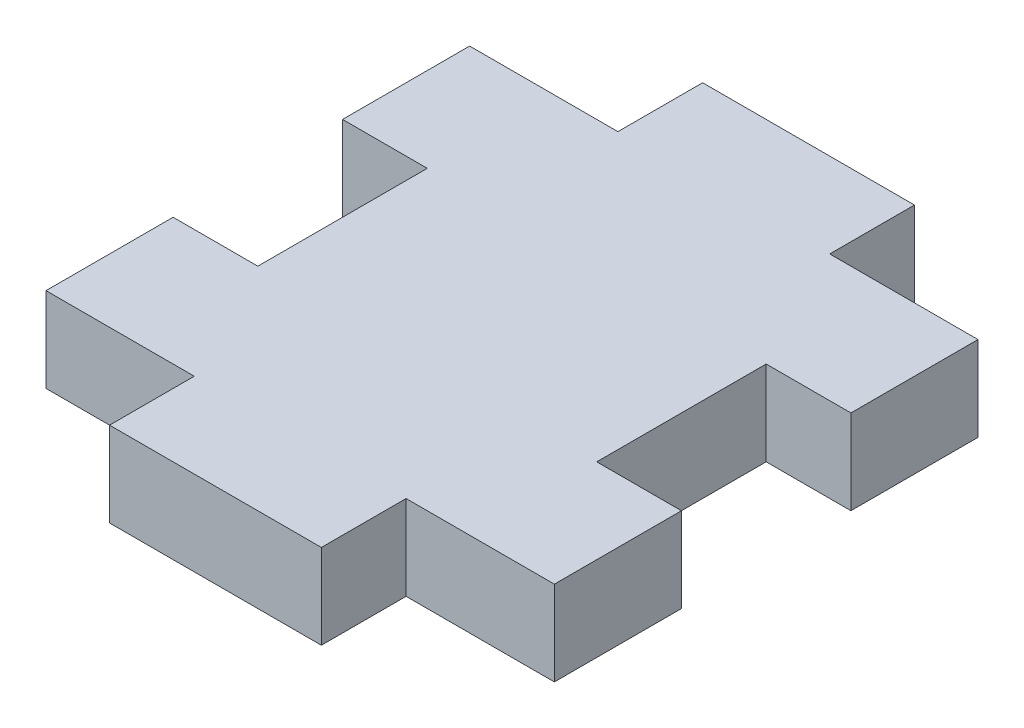
ISO-10303-21;
HEADER;
FILE_DESCRIPTION(('STEP AP214'),'2;1');
FILE_NAME('part.step','',(''),(''),'','','');
FILE_SCHEMA(('AUTOMOTIVE_DESIGN { 1 0 10303 214 1 1 1 1 }'));
ENDSEC;
DATA;
#1=APPLICATION_CONTEXT('core data for automotive mechanical design processes');
#2=APPLICATION_PROTOCOL_DEFINITION('international standard','automotive_design',2000,#1);
#3=PRODUCT_CONTEXT('',#1,'mechanical');
#4=PRODUCT('Part','Part','',(#3));
#5=PRODUCT_RELATED_PRODUCT_CATEGORY('part','',(#4));
#6=PRODUCT_DEFINITION_FORMATION('','',#4);
#7=PRODUCT_DEFINITION_CONTEXT('part definition',#1,'design');
#8=PRODUCT_DEFINITION('design','',#6,#7);
#9=PRODUCT_DEFINITION_SHAPE('','',#8);
#10=(LENGTH_UNIT() NAMED_UNIT(*) SI_UNIT(.MILLI.,.METRE.));
#11=(NAMED_UNIT(*) PLANE_ANGLE_UNIT() SI_UNIT($,.RADIAN.));
#12=(NAMED_UNIT(*) SI_UNIT($,.STERADIAN.) SOLID_ANGLE_UNIT());
#13=UNCERTAINTY_MEASURE_WITH_UNIT(LENGTH_MEASURE(1.E-05),#10,'distance_accuracy_value','');
#14=(GEOMETRIC_REPRESENTATION_CONTEXT(3) GLOBAL_UNCERTAINTY_ASSIGNED_CONTEXT((#13)) GLOBAL_UNIT_ASSIGNED_CONTEXT((#10,
#11,#12)) REPRESENTATION_CONTEXT('',''));
#15=CARTESIAN_POINT('',(0.,0.,0.));
#16=DIRECTION('',(0.,0.,1.));
#17=DIRECTION('',(1.,0.,0.));
#18=AXIS2_PLACEMENT_3D('',#15,#16,#17);
#19=CARTESIAN_POINT('',(38.1,12.7,31.75));
#20=DIRECTION('',(-1.,0.,0.));
#21=DIRECTION('',(0.,0.,1.));
#22=AXIS2_PLACEMENT_3D('',#19,#20,#21);
#23=PLANE('',#22);
#24=DIRECTION('',(0.,0.,-1.));
#25=VECTOR('',#24,1.);
#26=CARTESIAN_POINT('',(38.1,0.,31.75));
#27=LINE('',#26,#25);
#28=CARTESIAN_POINT('',(38.1,0.,31.75));
#29=VERTEX_POINT('',#28);
#30=CARTESIAN_POINT('',(38.1,0.,12.7));
#31=VERTEX_POINT('',#30);
#32=EDGE_CURVE('E204',#29,#31,#27,.T.);
#33=ORIENTED_EDGE('',*,*,#32,.T.);
#34=DIRECTION('',(0.,-1.,0.));
#35=VECTOR('',#34,1.);
#36=CARTESIAN_POINT('',(38.1,12.7,12.7));
#37=LINE('',#36,#35);
#38=CARTESIAN_POINT('',(38.1,12.7,12.7));
#39=VERTEX_POINT('',#38);
#40=EDGE_CURVE('E11',#39,#31,#37,.T.);
#41=ORIENTED_EDGE('',*,*,#40,.F.);
#42=DIRECTION('',(0.,0.,-1.));
#43=VECTOR('',#42,1.);
#44=CARTESIAN_POINT('',(38.1,12.7,31.75));
#45=LINE('',#44,#43);
#46=CARTESIAN_POINT('',(38.1,12.7,31.75));
#47=VERTEX_POINT('',#46);
#48=EDGE_CURVE('E254',#47,#39,#45,.T.);
#49=ORIENTED_EDGE('',*,*,#48,.F.);
#50=DIRECTION('',(0.,-1.,0.));
#51=VECTOR('',#50,1.);
#52=CARTESIAN_POINT('',(38.1,12.7,31.75));
#53=LINE('',#52,#51);
#54=EDGE_CURVE('E49',#47,#29,#53,.T.);
#55=ORIENTED_EDGE('',*,*,#54,.T.);
#56=EDGE_LOOP('',(#33,#41,#49,#55));
#57=FACE_BOUND('',#56,.T.);
#58=ADVANCED_FACE('F33',(#57),#23,.F.);
#59=CARTESIAN_POINT('',(38.1,12.7,12.7));
#60=DIRECTION('',(0.,0.,1.));
#61=DIRECTION('',(1.,0.,0.));
#62=AXIS2_PLACEMENT_3D('',#59,#60,#61);
#63=PLANE('',#62);
#64=DIRECTION('',(-1.,0.,0.));
#65=VECTOR('',#64,1.);
#66=CARTESIAN_POINT('',(38.1,0.,12.7));
#67=LINE('',#66,#65);
#68=CARTESIAN_POINT('',(25.4,0.,12.7));
#69=VERTEX_POINT('',#68);
#70=EDGE_CURVE('E206',#31,#69,#67,.T.);
#71=ORIENTED_EDGE('',*,*,#70,.T.);
#72=DIRECTION('',(0.,-1.,0.));
#73=VECTOR('',#72,1.);
#74=CARTESIAN_POINT('',(25.4,12.7,12.7));
#75=LINE('',#74,#73);
#76=CARTESIAN_POINT('',(25.4,12.7,12.7));
#77=VERTEX_POINT('',#76);
#78=EDGE_CURVE('E41',#77,#69,#75,.T.);
#79=ORIENTED_EDGE('',*,*,#78,.F.);
#80=DIRECTION('',(-1.,0.,0.));
#81=VECTOR('',#80,1.);
#82=CARTESIAN_POINT('',(38.1,12.7,12.7));
#83=LINE('',#82,#81);
#84=EDGE_CURVE('E124',#39,#77,#83,.T.);
#85=ORIENTED_EDGE('',*,*,#84,.F.);
#86=ORIENTED_EDGE('',*,*,#40,.T.);
#87=EDGE_LOOP('',(#71,#79,#85,#86));
#88=FACE_BOUND('',#87,.T.);
#89=ADVANCED_FACE('F363',(#88),#63,.F.);
#90=CARTESIAN_POINT('',(25.4,12.7,12.7));
#91=DIRECTION('',(-1.,0.,0.));
#92=DIRECTION('',(0.,0.,1.));
#93=AXIS2_PLACEMENT_3D('',#90,#91,#92);
#94=PLANE('',#93);
#95=DIRECTION('',(0.,0.,-1.));
#96=VECTOR('',#95,1.);
#97=CARTESIAN_POINT('',(25.4,0.,12.7));
#98=LINE('',#97,#96);
#99=CARTESIAN_POINT('',(25.4,0.,-12.7));
#100=VERTEX_POINT('',#99);
#101=EDGE_CURVE('E208',#69,#100,#98,.T.);
#102=ORIENTED_EDGE('',*,*,#101,.T.);
#103=DIRECTION('',(0.,-1.,0.));
#104=VECTOR('',#103,1.);
#105=CARTESIAN_POINT('',(25.4,12.7,-12.7));
#106=LINE('',#105,#104);
#107=CARTESIAN_POINT('',(25.4,12.7,-12.7));
#108=VERTEX_POINT('',#107);
#109=EDGE_CURVE('E288',#108,#100,#106,.T.);
#110=ORIENTED_EDGE('',*,*,#109,.F.);
#111=DIRECTION('',(0.,0.,-1.));
#112=VECTOR('',#111,1.);
#113=CARTESIAN_POINT('',(25.4,12.7,12.7));
#114=LINE('',#113,#112);
#115=EDGE_CURVE('E296',#77,#108,#114,.T.);
#116=ORIENTED_EDGE('',*,*,#115,.F.);
#117=ORIENTED_EDGE('',*,*,#78,.T.);
#118=EDGE_LOOP('',(#102,#110,#116,#117));
#119=FACE_BOUND('',#118,.T.);
#120=ADVANCED_FACE('F294',(#119),#94,.F.);
#121=CARTESIAN_POINT('',(25.4,12.7,-12.7));
#122=DIRECTION('',(0.,0.,-1.));
#123=DIRECTION('',(-1.,0.,0.));
#124=AXIS2_PLACEMENT_3D('',#121,#122,#123);
#125=PLANE('',#124);
#126=DIRECTION('',(1.,0.,0.));
#127=VECTOR('',#126,1.);
#128=CARTESIAN_POINT('',(25.4,0.,-12.7));
#129=LINE('',#128,#127);
#130=CARTESIAN_POINT('',(38.1,0.,-12.7));
#131=VERTEX_POINT('',#130);
#132=EDGE_CURVE('E210',#100,#131,#129,.T.);
#133=ORIENTED_EDGE('',*,*,#132,.T.);
#134=DIRECTION('',(0.,-1.,0.));
#135=VECTOR('',#134,1.);
#136=CARTESIAN_POINT('',(38.1,12.7,-12.7));
#137=LINE('',#136,#135);
#138=CARTESIAN_POINT('',(38.1,12.7,-12.7));
#139=VERTEX_POINT('',#138);
#140=EDGE_CURVE('E285',#139,#131,#137,.T.);
#141=ORIENTED_EDGE('',*,*,#140,.F.);
#142=DIRECTION('',(1.,0.,0.));
#143=VECTOR('',#142,1.);
#144=CARTESIAN_POINT('',(25.4,12.7,-12.7));
#145=LINE('',#144,#143);
#146=EDGE_CURVE('E313',#108,#139,#145,.T.);
#147=ORIENTED_EDGE('',*,*,#146,.F.);
#148=ORIENTED_EDGE('',*,*,#109,.T.);
#149=EDGE_LOOP('',(#133,#141,#147,#148));
#150=FACE_BOUND('',#149,.T.);
#151=ADVANCED_FACE('F304',(#150),#125,.F.);
#152=CARTESIAN_POINT('',(38.1,12.7,-12.7));
#153=DIRECTION('',(-1.,0.,0.));
#154=DIRECTION('',(0.,0.,1.));
#155=AXIS2_PLACEMENT_3D('',#152,#153,#154);
#156=PLANE('',#155);
#157=DIRECTION('',(0.,0.,-1.));
#158=VECTOR('',#157,1.);
#159=CARTESIAN_POINT('',(38.1,0.,-12.7));
#160=LINE('',#159,#158);
#161=CARTESIAN_POINT('',(38.1,0.,-31.75));
#162=VERTEX_POINT('',#161);
#163=EDGE_CURVE('E212',#131,#162,#160,.T.);
#164=ORIENTED_EDGE('',*,*,#163,.T.);
#165=DIRECTION('',(0.,-1.,0.));
#166=VECTOR('',#165,1.);
#167=CARTESIAN_POINT('',(38.1,12.7,-31.75));
#168=LINE('',#167,#166);
#169=CARTESIAN_POINT('',(38.1,12.7,-31.75));
#170=VERTEX_POINT('',#169);
#171=EDGE_CURVE('E282',#170,#162,#168,.T.);
#172=ORIENTED_EDGE('',*,*,#171,.F.);
#173=DIRECTION('',(0.,0.,-1.));
#174=VECTOR('',#173,1.);
#175=CARTESIAN_POINT('',(38.1,12.7,-12.7));
#176=LINE('',#175,#174);
#177=EDGE_CURVE('E310',#139,#170,#176,.T.);
#178=ORIENTED_EDGE('',*,*,#177,.F.);
#179=ORIENTED_EDGE('',*,*,#140,.T.);
#180=EDGE_LOOP('',(#164,#172,#178,#179));
#181=FACE_BOUND('',#180,.T.);
#182=ADVANCED_FACE('F308',(#181),#156,.F.);
#183=CARTESIAN_POINT('',(38.1,12.7,-31.75));
#184=DIRECTION('',(0.,0.,1.));
#185=DIRECTION('',(1.,0.,0.));
#186=AXIS2_PLACEMENT_3D('',#183,#184,#185);
#187=PLANE('',#186);
#188=DIRECTION('',(-1.,0.,0.));
#189=VECTOR('',#188,1.);
#190=CARTESIAN_POINT('',(38.1,0.,-31.75));
#191=LINE('',#190,#189);
#192=CARTESIAN_POINT('',(15.875,0.,-31.75));
#193=VERTEX_POINT('',#192);
#194=EDGE_CURVE('E214',#162,#193,#191,.T.);
#195=ORIENTED_EDGE('',*,*,#194,.T.);
#196=DIRECTION('',(0.,-1.,0.));
#197=VECTOR('',#196,1.);
#198=CARTESIAN_POINT('',(15.875,12.7,-31.75));
#199=LINE('',#198,#197);
#200=CARTESIAN_POINT('',(15.875,12.7,-31.75));
#201=VERTEX_POINT('',#200);
#202=EDGE_CURVE('E279',#201,#193,#199,.T.);
#203=ORIENTED_EDGE('',*,*,#202,.F.);
#204=DIRECTION('',(-1.,0.,0.));
#205=VECTOR('',#204,1.);
#206=CARTESIAN_POINT('',(38.1,12.7,-31.75));
#207=LINE('',#206,#205);
#208=EDGE_CURVE('E312',#170,#201,#207,.T.);
#209=ORIENTED_EDGE('',*,*,#208,.F.);
#210=ORIENTED_EDGE('',*,*,#171,.T.);
#211=EDGE_LOOP('',(#195,#203,#209,#210));
#212=FACE_BOUND('',#211,.T.);
#213=ADVANCED_FACE('F379',(#212),#187,.F.);
#214=CARTESIAN_POINT('',(15.875,12.7,-31.75));
#215=DIRECTION('',(-1.,0.,0.));
#216=DIRECTION('',(0.,0.,1.));
#217=AXIS2_PLACEMENT_3D('',#214,#215,#216);
#218=PLANE('',#217);
#219=DIRECTION('',(0.,0.,-1.));
#220=VECTOR('',#219,1.);
#221=CARTESIAN_POINT('',(15.875,0.,-31.75));
#222=LINE('',#221,#220);
#223=CARTESIAN_POINT('',(15.875,0.,-44.45));
#224=VERTEX_POINT('',#223);
#225=EDGE_CURVE('E216',#193,#224,#222,.T.);
#226=ORIENTED_EDGE('',*,*,#225,.T.);
#227=DIRECTION('',(0.,-1.,0.));
#228=VECTOR('',#227,1.);
#229=CARTESIAN_POINT('',(15.875,12.7,-44.45));
#230=LINE('',#229,#228);
#231=CARTESIAN_POINT('',(15.875,12.7,-44.45));
#232=VERTEX_POINT('',#231);
#233=EDGE_CURVE('E276',#232,#224,#230,.T.);
#234=ORIENTED_EDGE('',*,*,#233,.F.);
#235=DIRECTION('',(0.,0.,-1.));
#236=VECTOR('',#235,1.);
#237=CARTESIAN_POINT('',(15.875,12.7,-31.75));
#238=LINE('',#237,#236);
#239=EDGE_CURVE('E315',#201,#232,#238,.T.);
#240=ORIENTED_EDGE('',*,*,#239,.F.);
#241=ORIENTED_EDGE('',*,*,#202,.T.);
#242=EDGE_LOOP('',(#226,#234,#240,#241));
#243=FACE_BOUND('',#242,.T.);
#244=ADVANCED_FACE('F382',(#243),#218,.F.);
#245=CARTESIAN_POINT('',(15.875,12.7,-44.45));
#246=DIRECTION('',(0.,0.,1.));
#247=DIRECTION('',(1.,0.,0.));
#248=AXIS2_PLACEMENT_3D('',#245,#246,#247);
#249=PLANE('',#248);
#250=DIRECTION('',(-1.,0.,0.));
#251=VECTOR('',#250,1.);
#252=CARTESIAN_POINT('',(15.875,0.,-44.45));
#253=LINE('',#252,#251);
#254=CARTESIAN_POINT('',(-15.875,0.,-44.45));
#255=VERTEX_POINT('',#254);
#256=EDGE_CURVE('E218',#224,#255,#253,.T.);
#257=ORIENTED_EDGE('',*,*,#256,.T.);
#258=DIRECTION('',(0.,-1.,0.));
#259=VECTOR('',#258,1.);
#260=CARTESIAN_POINT('',(-15.875,12.7,-44.45));
#261=LINE('',#260,#259);
#262=CARTESIAN_POINT('',(-15.875,12.7,-44.45));
#263=VERTEX_POINT('',#262);
#264=EDGE_CURVE('E274',#263,#255,#261,.T.);
#265=ORIENTED_EDGE('',*,*,#264,.F.);
#266=DIRECTION('',(-1.,0.,0.));
#267=VECTOR('',#266,1.);
#268=CARTESIAN_POINT('',(15.875,12.7,-44.45));
#269=LINE('',#268,#267);
#270=EDGE_CURVE('E321',#232,#263,#269,.T.);
#271=ORIENTED_EDGE('',*,*,#270,.F.);
#272=ORIENTED_EDGE('',*,*,#233,.T.);
#273=EDGE_LOOP('',(#257,#265,#271,#272));
#274=FACE_BOUND('',#273,.T.);
#275=ADVANCED_FACE('F386',(#274),#249,.F.);
#276=CARTESIAN_POINT('',(-15.875,12.7,-31.75));
#277=DIRECTION('',(-1.,0.,0.));
#278=DIRECTION('',(0.,0.,1.));
#279=AXIS2_PLACEMENT_3D('',#276,#277,#278);
#280=PLANE('',#279);
#281=DIRECTION('',(0.,0.,-1.));
#282=VECTOR('',#281,1.);
#283=CARTESIAN_POINT('',(-15.875,0.,-31.75));
#284=LINE('',#283,#282);
#285=CARTESIAN_POINT('',(-15.875,0.,-31.75));
#286=VERTEX_POINT('',#285);
#287=EDGE_CURVE('E221',#286,#255,#284,.T.);
#288=ORIENTED_EDGE('',*,*,#287,.F.);
#289=DIRECTION('',(0.,-1.,0.));
#290=VECTOR('',#289,1.);
#291=CARTESIAN_POINT('',(-15.875,12.7,-31.75));
#292=LINE('',#291,#290);
#293=CARTESIAN_POINT('',(-15.875,12.7,-31.75));
#294=VERTEX_POINT('',#293);
#295=EDGE_CURVE('E272',#294,#286,#292,.T.);
#296=ORIENTED_EDGE('',*,*,#295,.F.);
#297=DIRECTION('',(0.,0.,-1.));
#298=VECTOR('',#297,1.);
#299=CARTESIAN_POINT('',(-15.875,12.7,-31.75));
#300=LINE('',#299,#298);
#301=EDGE_CURVE('E323',#294,#263,#300,.T.);
#302=ORIENTED_EDGE('',*,*,#301,.T.);
#303=ORIENTED_EDGE('',*,*,#264,.T.);
#304=EDGE_LOOP('',(#288,#296,#302,#303));
#305=FACE_BOUND('',#304,.T.);
#306=ADVANCED_FACE('F390',(#305),#280,.T.);
#307=CARTESIAN_POINT('',(-15.875,12.7,-31.75));
#308=DIRECTION('',(0.,0.,1.));
#309=DIRECTION('',(1.,0.,0.));
#310=AXIS2_PLACEMENT_3D('',#307,#308,#309);
#311=PLANE('',#310);
#312=DIRECTION('',(-1.,0.,0.));
#313=VECTOR('',#312,1.);
#314=CARTESIAN_POINT('',(-15.875,0.,-31.75));
#315=LINE('',#314,#313);
#316=CARTESIAN_POINT('',(-38.1,0.,-31.75));
#317=VERTEX_POINT('',#316);
#318=EDGE_CURVE('E224',#286,#317,#315,.T.);
#319=ORIENTED_EDGE('',*,*,#318,.T.);
#320=DIRECTION('',(0.,-1.,0.));
#321=VECTOR('',#320,1.);
#322=CARTESIAN_POINT('',(-38.1,12.7,-31.75));
#323=LINE('',#322,#321);
#324=CARTESIAN_POINT('',(-38.1,12.7,-31.75));
#325=VERTEX_POINT('',#324);
#326=EDGE_CURVE('E270',#325,#317,#323,.T.);
#327=ORIENTED_EDGE('',*,*,#326,.F.);
#328=DIRECTION('',(-1.,0.,0.));
#329=VECTOR('',#328,1.);
#330=CARTESIAN_POINT('',(-15.875,12.7,-31.75));
#331=LINE('',#330,#329);
#332=EDGE_CURVE('E326',#294,#325,#331,.T.);
#333=ORIENTED_EDGE('',*,*,#332,.F.);
#334=ORIENTED_EDGE('',*,*,#295,.T.);
#335=EDGE_LOOP('',(#319,#327,#333,#334));
#336=FACE_BOUND('',#335,.T.);
#337=ADVANCED_FACE('F394',(#336),#311,.F.);
#338=CARTESIAN_POINT('',(-38.1,12.7,-12.7));
#339=DIRECTION('',(-1.,0.,0.));
#340=DIRECTION('',(0.,0.,1.));
#341=AXIS2_PLACEMENT_3D('',#338,#339,#340);
#342=PLANE('',#341);
#343=DIRECTION('',(0.,0.,-1.));
#344=VECTOR('',#343,1.);
#345=CARTESIAN_POINT('',(-38.1,0.,-12.7));
#346=LINE('',#345,#344);
#347=CARTESIAN_POINT('',(-38.1,0.,-12.7));
#348=VERTEX_POINT('',#347);
#349=EDGE_CURVE('E227',#348,#317,#346,.T.);
#350=ORIENTED_EDGE('',*,*,#349,.F.);
#351=DIRECTION('',(0.,-1.,0.));
#352=VECTOR('',#351,1.);
#353=CARTESIAN_POINT('',(-38.1,12.7,-12.7));
#354=LINE('',#353,#352);
#355=CARTESIAN_POINT('',(-38.1,12.7,-12.7));
#356=VERTEX_POINT('',#355);
#357=EDGE_CURVE('E268',#356,#348,#354,.T.);
#358=ORIENTED_EDGE('',*,*,#357,.F.);
#359=DIRECTION('',(0.,0.,-1.));
#360=VECTOR('',#359,1.);
#361=CARTESIAN_POINT('',(-38.1,12.7,-12.7));
#362=LINE('',#361,#360);
#363=EDGE_CURVE('E328',#356,#325,#362,.T.);
#364=ORIENTED_EDGE('',*,*,#363,.T.);
#365=ORIENTED_EDGE('',*,*,#326,.T.);
#366=EDGE_LOOP('',(#350,#358,#364,#365));
#367=FACE_BOUND('',#366,.T.);
#368=ADVANCED_FACE('F398',(#367),#342,.T.);
#369=CARTESIAN_POINT('',(-25.4,12.7,-12.7));
#370=DIRECTION('',(0.,0.,1.));
#371=DIRECTION('',(1.,0.,0.));
#372=AXIS2_PLACEMENT_3D('',#369,#370,#371);
#373=PLANE('',#372);
#374=DIRECTION('',(-1.,0.,0.));
#375=VECTOR('',#374,1.);
#376=CARTESIAN_POINT('',(-25.4,0.,-12.7));
#377=LINE('',#376,#375);
#378=CARTESIAN_POINT('',(-25.4,0.,-12.7));
#379=VERTEX_POINT('',#378);
#380=EDGE_CURVE('E230',#379,#348,#377,.T.);
#381=ORIENTED_EDGE('',*,*,#380,.F.);
#382=DIRECTION('',(0.,-1.,0.));
#383=VECTOR('',#382,1.);
#384=CARTESIAN_POINT('',(-25.4,12.7,-12.7));
#385=LINE('',#384,#383);
#386=CARTESIAN_POINT('',(-25.4,12.7,-12.7));
#387=VERTEX_POINT('',#386);
#388=EDGE_CURVE('E266',#387,#379,#385,.T.);
#389=ORIENTED_EDGE('',*,*,#388,.F.);
#390=DIRECTION('',(-1.,0.,0.));
#391=VECTOR('',#390,1.);
#392=CARTESIAN_POINT('',(-25.4,12.7,-12.7));
#393=LINE('',#392,#391);
#394=EDGE_CURVE('E331',#387,#356,#393,.T.);
#395=ORIENTED_EDGE('',*,*,#394,.T.);
#396=ORIENTED_EDGE('',*,*,#357,.T.);
#397=EDGE_LOOP('',(#381,#389,#395,#396));
#398=FACE_BOUND('',#397,.T.);
#399=ADVANCED_FACE('F402',(#398),#373,.T.);
#400=CARTESIAN_POINT('',(-25.4,12.7,12.7));
#401=DIRECTION('',(-1.,0.,0.));
#402=DIRECTION('',(0.,0.,1.));
#403=AXIS2_PLACEMENT_3D('',#400,#401,#402);
#404=PLANE('',#403);
#405=DIRECTION('',(0.,0.,-1.));
#406=VECTOR('',#405,1.);
#407=CARTESIAN_POINT('',(-25.4,0.,12.7));
#408=LINE('',#407,#406);
#409=CARTESIAN_POINT('',(-25.4,0.,12.7));
#410=VERTEX_POINT('',#409);
#411=EDGE_CURVE('E233',#410,#379,#408,.T.);
#412=ORIENTED_EDGE('',*,*,#411,.F.);
#413=DIRECTION('',(0.,-1.,0.));
#414=VECTOR('',#413,1.);
#415=CARTESIAN_POINT('',(-25.4,12.7,12.7));
#416=LINE('',#415,#414);
#417=CARTESIAN_POINT('',(-25.4,12.7,12.7));
#418=VERTEX_POINT('',#417);
#419=EDGE_CURVE('E264',#418,#410,#416,.T.);
#420=ORIENTED_EDGE('',*,*,#419,.F.);
#421=DIRECTION('',(0.,0.,-1.));
#422=VECTOR('',#421,1.);
#423=CARTESIAN_POINT('',(-25.4,12.7,12.7));
#424=LINE('',#423,#422);
#425=EDGE_CURVE('E334',#418,#387,#424,.T.);
#426=ORIENTED_EDGE('',*,*,#425,.T.);
#427=ORIENTED_EDGE('',*,*,#388,.T.);
#428=EDGE_LOOP('',(#412,#420,#426,#427));
#429=FACE_BOUND('',#428,.T.);
#430=ADVANCED_FACE('F406',(#429),#404,.T.);
#431=CARTESIAN_POINT('',(-38.1,12.7,12.7));
#432=DIRECTION('',(0.,0.,-1.));
#433=DIRECTION('',(-1.,0.,0.));
#434=AXIS2_PLACEMENT_3D('',#431,#432,#433);
#435=PLANE('',#434);
#436=DIRECTION('',(1.,0.,0.));
#437=VECTOR('',#436,1.);
#438=CARTESIAN_POINT('',(-38.1,0.,12.7));
#439=LINE('',#438,#437);
#440=CARTESIAN_POINT('',(-38.1,0.,12.7));
#441=VERTEX_POINT('',#440);
#442=EDGE_CURVE('E236',#441,#410,#439,.T.);
#443=ORIENTED_EDGE('',*,*,#442,.F.);
#444=DIRECTION('',(0.,-1.,0.));
#445=VECTOR('',#444,1.);
#446=CARTESIAN_POINT('',(-38.1,12.7,12.7));
#447=LINE('',#446,#445);
#448=CARTESIAN_POINT('',(-38.1,12.7,12.7));
#449=VERTEX_POINT('',#448);
#450=EDGE_CURVE('E262',#449,#441,#447,.T.);
#451=ORIENTED_EDGE('',*,*,#450,.F.);
#452=DIRECTION('',(1.,0.,0.));
#453=VECTOR('',#452,1.);
#454=CARTESIAN_POINT('',(-38.1,12.7,12.7));
#455=LINE('',#454,#453);
#456=EDGE_CURVE('E337',#449,#418,#455,.T.);
#457=ORIENTED_EDGE('',*,*,#456,.T.);
#458=ORIENTED_EDGE('',*,*,#419,.T.);
#459=EDGE_LOOP('',(#443,#451,#457,#458));
#460=FACE_BOUND('',#459,.T.);
#461=ADVANCED_FACE('F410',(#460),#435,.T.);
#462=CARTESIAN_POINT('',(-38.1,12.7,31.75));
#463=DIRECTION('',(-1.,0.,0.));
#464=DIRECTION('',(0.,0.,1.));
#465=AXIS2_PLACEMENT_3D('',#462,#463,#464);
#466=PLANE('',#465);
#467=DIRECTION('',(0.,0.,-1.));
#468=VECTOR('',#467,1.);
#469=CARTESIAN_POINT('',(-38.1,0.,31.75));
#470=LINE('',#469,#468);
#471=CARTESIAN_POINT('',(-38.1,0.,31.75));
#472=VERTEX_POINT('',#471);
#473=EDGE_CURVE('E239',#472,#441,#470,.T.);
#474=ORIENTED_EDGE('',*,*,#473,.F.);
#475=DIRECTION('',(0.,-1.,0.));
#476=VECTOR('',#475,1.);
#477=CARTESIAN_POINT('',(-38.1,12.7,31.75));
#478=LINE('',#477,#476);
#479=CARTESIAN_POINT('',(-38.1,12.7,31.75));
#480=VERTEX_POINT('',#479);
#481=EDGE_CURVE('E260',#480,#472,#478,.T.);
#482=ORIENTED_EDGE('',*,*,#481,.F.);
#483=DIRECTION('',(0.,0.,-1.));
#484=VECTOR('',#483,1.);
#485=CARTESIAN_POINT('',(-38.1,12.7,31.75));
#486=LINE('',#485,#484);
#487=EDGE_CURVE('E340',#480,#449,#486,.T.);
#488=ORIENTED_EDGE('',*,*,#487,.T.);
#489=ORIENTED_EDGE('',*,*,#450,.T.);
#490=EDGE_LOOP('',(#474,#482,#488,#489));
#491=FACE_BOUND('',#490,.T.);
#492=ADVANCED_FACE('F414',(#491),#466,.T.);
#493=CARTESIAN_POINT('',(-15.875,12.7,31.75));
#494=DIRECTION('',(0.,0.,1.));
#495=DIRECTION('',(1.,0.,0.));
#496=AXIS2_PLACEMENT_3D('',#493,#494,#495);
#497=PLANE('',#496);
#498=DIRECTION('',(-1.,0.,0.));
#499=VECTOR('',#498,1.);
#500=CARTESIAN_POINT('',(-15.875,0.,31.75));
#501=LINE('',#500,#499);
#502=CARTESIAN_POINT('',(-15.875,0.,31.75));
#503=VERTEX_POINT('',#502);
#504=EDGE_CURVE('E242',#503,#472,#501,.T.);
#505=ORIENTED_EDGE('',*,*,#504,.F.);
#506=DIRECTION('',(0.,-1.,0.));
#507=VECTOR('',#506,1.);
#508=CARTESIAN_POINT('',(-15.875,12.7,31.75));
#509=LINE('',#508,#507);
#510=CARTESIAN_POINT('',(-15.875,12.7,31.75));
#511=VERTEX_POINT('',#510);
#512=EDGE_CURVE('E258',#511,#503,#509,.T.);
#513=ORIENTED_EDGE('',*,*,#512,.F.);
#514=DIRECTION('',(-1.,0.,0.));
#515=VECTOR('',#514,1.);
#516=CARTESIAN_POINT('',(-15.875,12.7,31.75));
#517=LINE('',#516,#515);
#518=EDGE_CURVE('E199',#511,#480,#517,.T.);
#519=ORIENTED_EDGE('',*,*,#518,.T.);
#520=ORIENTED_EDGE('',*,*,#481,.T.);
#521=EDGE_LOOP('',(#505,#513,#519,#520));
#522=FACE_BOUND('',#521,.T.);
#523=ADVANCED_FACE('F345',(#522),#497,.T.);
#524=CARTESIAN_POINT('',(-15.875,12.7,44.45));
#525=DIRECTION('',(-1.,0.,0.));
#526=DIRECTION('',(0.,0.,1.));
#527=AXIS2_PLACEMENT_3D('',#524,#525,#526);
#528=PLANE('',#527);
#529=DIRECTION('',(0.,0.,-1.));
#530=VECTOR('',#529,1.);
#531=CARTESIAN_POINT('',(-15.875,0.,44.45));
#532=LINE('',#531,#530);
#533=CARTESIAN_POINT('',(-15.875,0.,44.45));
#534=VERTEX_POINT('',#533);
#535=EDGE_CURVE('E245',#534,#503,#532,.T.);
#536=ORIENTED_EDGE('',*,*,#535,.F.);
#537=DIRECTION('',(0.,-1.,0.));
#538=VECTOR('',#537,1.);
#539=CARTESIAN_POINT('',(-15.875,12.7,44.45));
#540=LINE('',#539,#538);
#541=CARTESIAN_POINT('',(-15.875,12.7,44.45));
#542=VERTEX_POINT('',#541);
#543=EDGE_CURVE('E185',#542,#534,#540,.T.);
#544=ORIENTED_EDGE('',*,*,#543,.F.);
#545=DIRECTION('',(0.,0.,-1.));
#546=VECTOR('',#545,1.);
#547=CARTESIAN_POINT('',(-15.875,12.7,44.45));
#548=LINE('',#547,#546);
#549=EDGE_CURVE('E197',#542,#511,#548,.T.);
#550=ORIENTED_EDGE('',*,*,#549,.T.);
#551=ORIENTED_EDGE('',*,*,#512,.T.);
#552=EDGE_LOOP('',(#536,#544,#550,#551));
#553=FACE_BOUND('',#552,.T.);
#554=ADVANCED_FACE('F351',(#553),#528,.T.);
#555=CARTESIAN_POINT('',(15.875,12.7,44.45));
#556=DIRECTION('',(0.,0.,1.));
#557=DIRECTION('',(1.,0.,0.));
#558=AXIS2_PLACEMENT_3D('',#555,#556,#557);
#559=PLANE('',#558);
#560=DIRECTION('',(-1.,0.,0.));
#561=VECTOR('',#560,1.);
#562=CARTESIAN_POINT('',(15.875,0.,44.45));
#563=LINE('',#562,#561);
#564=CARTESIAN_POINT('',(15.875,0.,44.45));
#565=VERTEX_POINT('',#564);
#566=EDGE_CURVE('E182',#565,#534,#563,.T.);
#567=ORIENTED_EDGE('',*,*,#566,.F.);
#568=DIRECTION('',(0.,-1.,0.));
#569=VECTOR('',#568,1.);
#570=CARTESIAN_POINT('',(15.875,12.7,44.45));
#571=LINE('',#570,#569);
#572=CARTESIAN_POINT('',(15.875,12.7,44.45));
#573=VERTEX_POINT('',#572);
#574=EDGE_CURVE('E176',#573,#565,#571,.T.);
#575=ORIENTED_EDGE('',*,*,#574,.F.);
#576=DIRECTION('',(-1.,0.,0.));
#577=VECTOR('',#576,1.);
#578=CARTESIAN_POINT('',(15.875,12.7,44.45));
#579=LINE('',#578,#577);
#580=EDGE_CURVE('E180',#573,#542,#579,.T.);
#581=ORIENTED_EDGE('',*,*,#580,.T.);
#582=ORIENTED_EDGE('',*,*,#543,.T.);
#583=EDGE_LOOP('',(#567,#575,#581,#582));
#584=FACE_BOUND('',#583,.T.);
#585=ADVANCED_FACE('F178',(#584),#559,.T.);
#586=CARTESIAN_POINT('',(15.875,12.7,44.45));
#587=DIRECTION('',(-1.,0.,0.));
#588=DIRECTION('',(0.,0.,1.));
#589=AXIS2_PLACEMENT_3D('',#586,#587,#588);
#590=PLANE('',#589);
#591=DIRECTION('',(0.,0.,-1.));
#592=VECTOR('',#591,1.);
#593=CARTESIAN_POINT('',(15.875,0.,44.45));
#594=LINE('',#593,#592);
#595=CARTESIAN_POINT('',(15.875,0.,31.75));
#596=VERTEX_POINT('',#595);
#597=EDGE_CURVE('E249',#565,#596,#594,.T.);
#598=ORIENTED_EDGE('',*,*,#597,.T.);
#599=DIRECTION('',(0.,-1.,0.));
#600=VECTOR('',#599,1.);
#601=CARTESIAN_POINT('',(15.875,12.7,31.75));
#602=LINE('',#601,#600);
#603=CARTESIAN_POINT('',(15.875,12.7,31.75));
#604=VERTEX_POINT('',#603);
#605=EDGE_CURVE('E112',#604,#596,#602,.T.);
#606=ORIENTED_EDGE('',*,*,#605,.F.);
#607=DIRECTION('',(0.,0.,-1.));
#608=VECTOR('',#607,1.);
#609=CARTESIAN_POINT('',(15.875,12.7,44.45));
#610=LINE('',#609,#608);
#611=EDGE_CURVE('E187',#573,#604,#610,.T.);
#612=ORIENTED_EDGE('',*,*,#611,.F.);
#613=ORIENTED_EDGE('',*,*,#574,.T.);
#614=EDGE_LOOP('',(#598,#606,#612,#613));
#615=FACE_BOUND('',#614,.T.);
#616=ADVANCED_FACE('F188',(#615),#590,.F.);
#617=CARTESIAN_POINT('',(38.1,12.7,31.75));
#618=DIRECTION('',(0.,0.,1.));
#619=DIRECTION('',(1.,0.,0.));
#620=AXIS2_PLACEMENT_3D('',#617,#618,#619);
#621=PLANE('',#620);
#622=DIRECTION('',(-1.,0.,0.));
#623=VECTOR('',#622,1.);
#624=CARTESIAN_POINT('',(38.1,0.,31.75));
#625=LINE('',#624,#623);
#626=EDGE_CURVE('E251',#29,#596,#625,.T.);
#627=ORIENTED_EDGE('',*,*,#626,.F.);
#628=ORIENTED_EDGE('',*,*,#54,.F.);
#629=DIRECTION('',(-1.,0.,0.));
#630=VECTOR('',#629,1.);
#631=CARTESIAN_POINT('',(38.1,12.7,31.75));
#632=LINE('',#631,#630);
#633=EDGE_CURVE('E191',#47,#604,#632,.T.);
#634=ORIENTED_EDGE('',*,*,#633,.T.);
#635=ORIENTED_EDGE('',*,*,#605,.T.);
#636=EDGE_LOOP('',(#627,#628,#634,#635));
#637=FACE_BOUND('',#636,.T.);
#638=ADVANCED_FACE('F352',(#637),#621,.T.);
#639=CARTESIAN_POINT('',(0.,12.7,0.));
#640=DIRECTION('',(0.,1.,0.));
#641=DIRECTION('',(0.,0.,1.));
#642=AXIS2_PLACEMENT_3D('',#639,#640,#641);
#643=PLANE('',#642);
#644=ORIENTED_EDGE('',*,*,#48,.T.);
#645=ORIENTED_EDGE('',*,*,#84,.T.);
#646=ORIENTED_EDGE('',*,*,#115,.T.);
#647=ORIENTED_EDGE('',*,*,#146,.T.);
#648=ORIENTED_EDGE('',*,*,#177,.T.);
#649=ORIENTED_EDGE('',*,*,#208,.T.);
#650=ORIENTED_EDGE('',*,*,#239,.T.);
#651=ORIENTED_EDGE('',*,*,#270,.T.);
#652=ORIENTED_EDGE('',*,*,#301,.F.);
#653=ORIENTED_EDGE('',*,*,#332,.T.);
#654=ORIENTED_EDGE('',*,*,#363,.F.);
#655=ORIENTED_EDGE('',*,*,#394,.F.);
#656=ORIENTED_EDGE('',*,*,#425,.F.);
#657=ORIENTED_EDGE('',*,*,#456,.F.);
#658=ORIENTED_EDGE('',*,*,#487,.F.);
#659=ORIENTED_EDGE('',*,*,#518,.F.);
#660=ORIENTED_EDGE('',*,*,#549,.F.);
#661=ORIENTED_EDGE('',*,*,#580,.F.);
#662=ORIENTED_EDGE('',*,*,#611,.T.);
#663=ORIENTED_EDGE('',*,*,#633,.F.);
#664=EDGE_LOOP('',(#644,#645,#646,#647,#648,#649,#650,#651,#652,#653,#654,#655,#656,#657,#658,
#659,#660,#661,#662,#663));
#665=FACE_BOUND('',#664,.T.);
#666=ADVANCED_FACE('F194',(#665),#643,.T.);
#667=CARTESIAN_POINT('',(0.,0.,0.));
#668=DIRECTION('',(0.,1.,0.));
#669=DIRECTION('',(0.,0.,1.));
#670=AXIS2_PLACEMENT_3D('',#667,#668,#669);
#671=PLANE('',#670);
#672=ORIENTED_EDGE('',*,*,#32,.F.);
#673=ORIENTED_EDGE('',*,*,#626,.T.);
#674=ORIENTED_EDGE('',*,*,#597,.F.);
#675=ORIENTED_EDGE('',*,*,#566,.T.);
#676=ORIENTED_EDGE('',*,*,#535,.T.);
#677=ORIENTED_EDGE('',*,*,#504,.T.);
#678=ORIENTED_EDGE('',*,*,#473,.T.);
#679=ORIENTED_EDGE('',*,*,#442,.T.);
#680=ORIENTED_EDGE('',*,*,#411,.T.);
#681=ORIENTED_EDGE('',*,*,#380,.T.);
#682=ORIENTED_EDGE('',*,*,#349,.T.);
#683=ORIENTED_EDGE('',*,*,#318,.F.);
#684=ORIENTED_EDGE('',*,*,#287,.T.);
#685=ORIENTED_EDGE('',*,*,#256,.F.);
#686=ORIENTED_EDGE('',*,*,#225,.F.);
#687=ORIENTED_EDGE('',*,*,#194,.F.);
#688=ORIENTED_EDGE('',*,*,#163,.F.);
#689=ORIENTED_EDGE('',*,*,#132,.F.);
#690=ORIENTED_EDGE('',*,*,#101,.F.);
#691=ORIENTED_EDGE('',*,*,#70,.F.);
#692=EDGE_LOOP('',(#672,#673,#674,#675,#676,#677,#678,#679,#680,#681,#682,#683,#684,#685,#686,
#687,#688,#689,#690,#691));
#693=FACE_BOUND('',#692,.T.);
#694=ADVANCED_FACE('F299',(#693),#671,.F.);
#695=CLOSED_SHELL('',(#58,#89,#120,#151,#182,#213,#244,#275,#306,#337,#368,#399,#430,#461,#492,
#523,#554,#585,#616,#638,#666,#694));
#696=MANIFOLD_SOLID_BREP('B2',#695);
#697=ADVANCED_BREP_SHAPE_REPRESENTATION('',(#18,#696),#14);
#698=SHAPE_DEFINITION_REPRESENTATION(#9,#697);
ENDSEC;
END-ISO-10303-21;
